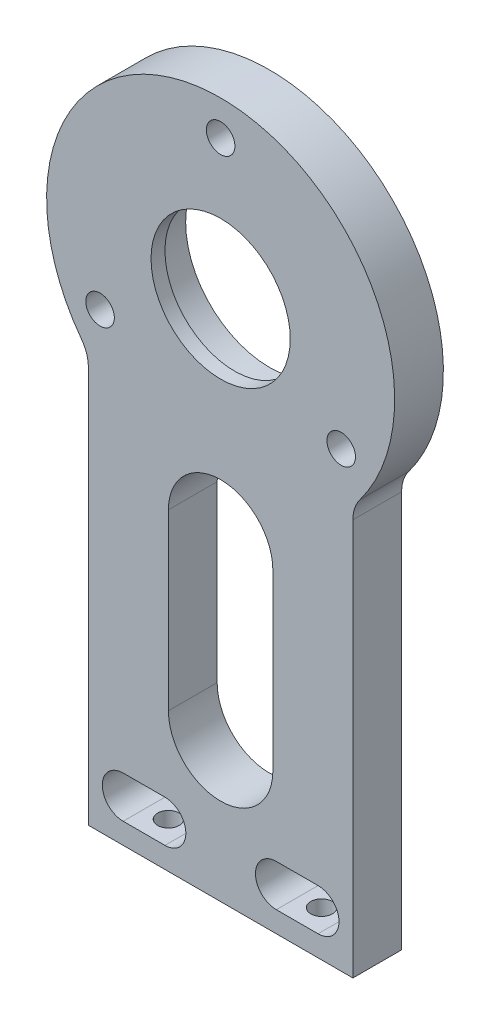
ISO-10303-21;
HEADER;
FILE_DESCRIPTION(('STEP AP214'),'2;1');
FILE_NAME('part.step','',(''),(''),'','','');
FILE_SCHEMA(('AUTOMOTIVE_DESIGN { 1 0 10303 214 1 1 1 1 }'));
ENDSEC;
DATA;
#1=APPLICATION_CONTEXT('core data for automotive mechanical design processes');
#2=APPLICATION_PROTOCOL_DEFINITION('international standard','automotive_design',2000,#1);
#3=PRODUCT_CONTEXT('',#1,'mechanical');
#4=PRODUCT('Part','Part','',(#3));
#5=PRODUCT_RELATED_PRODUCT_CATEGORY('part','',(#4));
#6=PRODUCT_DEFINITION_FORMATION('','',#4);
#7=PRODUCT_DEFINITION_CONTEXT('part definition',#1,'design');
#8=PRODUCT_DEFINITION('design','',#6,#7);
#9=PRODUCT_DEFINITION_SHAPE('','',#8);
#10=(LENGTH_UNIT() NAMED_UNIT(*) SI_UNIT(.MILLI.,.METRE.));
#11=(NAMED_UNIT(*) PLANE_ANGLE_UNIT() SI_UNIT($,.RADIAN.));
#12=(NAMED_UNIT(*) SI_UNIT($,.STERADIAN.) SOLID_ANGLE_UNIT());
#13=UNCERTAINTY_MEASURE_WITH_UNIT(LENGTH_MEASURE(1.E-05),#10,'distance_accuracy_value','');
#14=(GEOMETRIC_REPRESENTATION_CONTEXT(3) GLOBAL_UNCERTAINTY_ASSIGNED_CONTEXT((#13)) GLOBAL_UNIT_ASSIGNED_CONTEXT((#10,
#11,#12)) REPRESENTATION_CONTEXT('',''));
#15=CARTESIAN_POINT('',(0.,0.,0.));
#16=DIRECTION('',(0.,0.,1.));
#17=DIRECTION('',(1.,0.,0.));
#18=AXIS2_PLACEMENT_3D('',#15,#16,#17);
#19=CARTESIAN_POINT('',(0.,95.,3.5));
#20=DIRECTION('',(0.,0.,-1.));
#21=DIRECTION('',(-1.,0.,0.));
#22=AXIS2_PLACEMENT_3D('',#19,#20,#21);
#23=CYLINDRICAL_SURFACE('',#22,2.04999999999999);
#24=CARTESIAN_POINT('',(0.,95.,3.5));
#25=DIRECTION('',(0.,0.,1.));
#26=DIRECTION('',(1.,0.,0.));
#27=AXIS2_PLACEMENT_3D('',#24,#25,#26);
#28=CIRCLE('',#27,2.04999999999999);
#29=CARTESIAN_POINT('',(2.04999999999999,95.,3.5));
#30=VERTEX_POINT('',#29);
#31=EDGE_CURVE('E361',#30,#30,#28,.T.);
#32=ORIENTED_EDGE('',*,*,#31,.T.);
#33=EDGE_LOOP('',(#32));
#34=FACE_BOUND('',#33,.T.);
#35=CARTESIAN_POINT('',(0.,95.,0.5));
#36=DIRECTION('',(0.,0.,-1.));
#37=DIRECTION('',(-1.,0.,0.));
#38=AXIS2_PLACEMENT_3D('',#35,#36,#37);
#39=CIRCLE('',#38,2.04999999999999);
#40=CARTESIAN_POINT('',(-2.04999999999999,95.,0.5));
#41=VERTEX_POINT('',#40);
#42=EDGE_CURVE('E294',#41,#41,#39,.T.);
#43=ORIENTED_EDGE('',*,*,#42,.T.);
#44=EDGE_LOOP('',(#43));
#45=FACE_BOUND('',#44,.T.);
#46=ADVANCED_FACE('F68',(#34,#45),#23,.F.);
#47=CARTESIAN_POINT('',(17.3205080756888,65.,3.5));
#48=DIRECTION('',(0.,0.,-1.));
#49=DIRECTION('',(-1.,0.,0.));
#50=AXIS2_PLACEMENT_3D('',#47,#48,#49);
#51=CYLINDRICAL_SURFACE('',#50,2.04999999999999);
#52=CARTESIAN_POINT('',(17.3205080756888,65.,3.5));
#53=DIRECTION('',(0.,0.,1.));
#54=DIRECTION('',(1.,0.,0.));
#55=AXIS2_PLACEMENT_3D('',#52,#53,#54);
#56=CIRCLE('',#55,2.04999999999999);
#57=CARTESIAN_POINT('',(19.3705080756888,65.,3.5));
#58=VERTEX_POINT('',#57);
#59=EDGE_CURVE('E358',#58,#58,#56,.T.);
#60=ORIENTED_EDGE('',*,*,#59,.T.);
#61=EDGE_LOOP('',(#60));
#62=FACE_BOUND('',#61,.T.);
#63=CARTESIAN_POINT('',(17.3205080756888,65.,0.5));
#64=DIRECTION('',(0.,0.,-1.));
#65=DIRECTION('',(-1.,0.,0.));
#66=AXIS2_PLACEMENT_3D('',#63,#64,#65);
#67=CIRCLE('',#66,2.04999999999999);
#68=CARTESIAN_POINT('',(15.2705080756888,65.,0.5));
#69=VERTEX_POINT('',#68);
#70=EDGE_CURVE('E291',#69,#69,#67,.T.);
#71=ORIENTED_EDGE('',*,*,#70,.T.);
#72=EDGE_LOOP('',(#71));
#73=FACE_BOUND('',#72,.T.);
#74=ADVANCED_FACE('F461',(#62,#73),#51,.F.);
#75=CARTESIAN_POINT('',(-17.3205080756888,65.,3.5));
#76=DIRECTION('',(0.,0.,-1.));
#77=DIRECTION('',(-1.,0.,0.));
#78=AXIS2_PLACEMENT_3D('',#75,#76,#77);
#79=CYLINDRICAL_SURFACE('',#78,2.04999999999998);
#80=CARTESIAN_POINT('',(-17.3205080756888,65.,3.5));
#81=DIRECTION('',(0.,0.,1.));
#82=DIRECTION('',(1.,0.,0.));
#83=AXIS2_PLACEMENT_3D('',#80,#81,#82);
#84=CIRCLE('',#83,2.04999999999998);
#85=CARTESIAN_POINT('',(-15.2705080756888,65.,3.5));
#86=VERTEX_POINT('',#85);
#87=EDGE_CURVE('E355',#86,#86,#84,.T.);
#88=ORIENTED_EDGE('',*,*,#87,.T.);
#89=EDGE_LOOP('',(#88));
#90=FACE_BOUND('',#89,.T.);
#91=CARTESIAN_POINT('',(-17.3205080756888,65.,0.5));
#92=DIRECTION('',(0.,0.,-1.));
#93=DIRECTION('',(-1.,0.,0.));
#94=AXIS2_PLACEMENT_3D('',#91,#92,#93);
#95=CIRCLE('',#94,2.04999999999998);
#96=CARTESIAN_POINT('',(-19.3705080756887,65.,0.5));
#97=VERTEX_POINT('',#96);
#98=EDGE_CURVE('E288',#97,#97,#95,.T.);
#99=ORIENTED_EDGE('',*,*,#98,.T.);
#100=EDGE_LOOP('',(#99));
#101=FACE_BOUND('',#100,.T.);
#102=ADVANCED_FACE('F467',(#90,#101),#79,.F.);
#103=CARTESIAN_POINT('',(0.,75.,3.5));
#104=DIRECTION('',(0.,0.,-1.));
#105=DIRECTION('',(-1.,0.,0.));
#106=AXIS2_PLACEMENT_3D('',#103,#104,#105);
#107=CYLINDRICAL_SURFACE('',#106,10.);
#108=CARTESIAN_POINT('',(0.,75.,3.5));
#109=DIRECTION('',(0.,0.,1.));
#110=DIRECTION('',(1.,0.,0.));
#111=AXIS2_PLACEMENT_3D('',#108,#109,#110);
#112=CIRCLE('',#111,10.);
#113=CARTESIAN_POINT('',(10.,75.,3.5));
#114=VERTEX_POINT('',#113);
#115=EDGE_CURVE('E364',#114,#114,#112,.T.);
#116=ORIENTED_EDGE('',*,*,#115,.T.);
#117=EDGE_LOOP('',(#116));
#118=FACE_BOUND('',#117,.T.);
#119=CARTESIAN_POINT('',(0.,75.,1.5));
#120=DIRECTION('',(0.,0.,-1.));
#121=DIRECTION('',(-1.,0.,0.));
#122=AXIS2_PLACEMENT_3D('',#119,#120,#121);
#123=CIRCLE('',#122,10.);
#124=CARTESIAN_POINT('',(-10.,75.,1.5));
#125=VERTEX_POINT('',#124);
#126=EDGE_CURVE('E284',#125,#125,#123,.T.);
#127=ORIENTED_EDGE('',*,*,#126,.T.);
#128=EDGE_LOOP('',(#127));
#129=FACE_BOUND('',#128,.T.);
#130=ADVANCED_FACE('F471',(#118,#129),#107,.F.);
#131=CARTESIAN_POINT('',(0.,0.,3.5));
#132=DIRECTION('',(0.,0.,1.));
#133=DIRECTION('',(1.,0.,0.));
#134=AXIS2_PLACEMENT_3D('',#131,#132,#133);
#135=PLANE('',#134);
#136=CARTESIAN_POINT('',(24.,57.,3.5));
#137=DIRECTION('',(0.,0.,1.));
#138=DIRECTION('',(1.,0.,0.));
#139=AXIS2_PLACEMENT_3D('',#136,#137,#138);
#140=CIRCLE('',#139,4.99999999999999);
#141=CARTESIAN_POINT('',(19.,57.,3.5));
#142=VERTEX_POINT('',#141);
#143=CARTESIAN_POINT('',(20.,60.,3.5));
#144=VERTEX_POINT('',#143);
#145=EDGE_CURVE('E342',#142,#144,#140,.F.);
#146=ORIENTED_EDGE('',*,*,#145,.T.);
#147=CARTESIAN_POINT('',(0.,75.,3.5));
#148=DIRECTION('',(0.,0.,1.));
#149=DIRECTION('',(1.,0.,0.));
#150=AXIS2_PLACEMENT_3D('',#147,#148,#149);
#151=CIRCLE('',#150,25.);
#152=CARTESIAN_POINT('',(-20.,60.,3.5));
#153=VERTEX_POINT('',#152);
#154=EDGE_CURVE('E154',#144,#153,#151,.T.);
#155=ORIENTED_EDGE('',*,*,#154,.T.);
#156=CARTESIAN_POINT('',(-24.,57.,3.5));
#157=DIRECTION('',(0.,0.,1.));
#158=DIRECTION('',(1.,0.,0.));
#159=AXIS2_PLACEMENT_3D('',#156,#157,#158);
#160=CIRCLE('',#159,4.99999999999999);
#161=CARTESIAN_POINT('',(-19.,57.,3.5));
#162=VERTEX_POINT('',#161);
#163=EDGE_CURVE('E345',#162,#153,#160,.T.);
#164=ORIENTED_EDGE('',*,*,#163,.F.);
#165=DIRECTION('',(0.,-1.,0.));
#166=VECTOR('',#165,1.);
#167=CARTESIAN_POINT('',(-19.,0.,3.5));
#168=LINE('',#167,#166);
#169=CARTESIAN_POINT('',(-19.,0.,3.5));
#170=VERTEX_POINT('',#169);
#171=EDGE_CURVE('E348',#162,#170,#168,.T.);
#172=ORIENTED_EDGE('',*,*,#171,.T.);
#173=DIRECTION('',(1.,0.,0.));
#174=VECTOR('',#173,1.);
#175=CARTESIAN_POINT('',(0.,0.,3.5));
#176=LINE('',#175,#174);
#177=CARTESIAN_POINT('',(19.,0.,3.5));
#178=VERTEX_POINT('',#177);
#179=EDGE_CURVE('E350',#170,#178,#176,.T.);
#180=ORIENTED_EDGE('',*,*,#179,.T.);
#181=DIRECTION('',(0.,-1.,0.));
#182=VECTOR('',#181,1.);
#183=CARTESIAN_POINT('',(19.,0.,3.5));
#184=LINE('',#183,#182);
#185=EDGE_CURVE('E352',#142,#178,#184,.T.);
#186=ORIENTED_EDGE('',*,*,#185,.F.);
#187=EDGE_LOOP('',(#146,#155,#164,#172,#180,#186));
#188=FACE_BOUND('',#187,.T.);
#189=ORIENTED_EDGE('',*,*,#87,.F.);
#190=EDGE_LOOP('',(#189));
#191=FACE_BOUND('',#190,.T.);
#192=ORIENTED_EDGE('',*,*,#59,.F.);
#193=EDGE_LOOP('',(#192));
#194=FACE_BOUND('',#193,.T.);
#195=ORIENTED_EDGE('',*,*,#31,.F.);
#196=EDGE_LOOP('',(#195));
#197=FACE_BOUND('',#196,.T.);
#198=ORIENTED_EDGE('',*,*,#115,.F.);
#199=EDGE_LOOP('',(#198));
#200=FACE_BOUND('',#199,.T.);
#201=CARTESIAN_POINT('',(-14.,6.,3.5));
#202=DIRECTION('',(0.,0.,1.));
#203=DIRECTION('',(1.,0.,0.));
#204=AXIS2_PLACEMENT_3D('',#201,#202,#203);
#205=CIRCLE('',#204,3.);
#206=CARTESIAN_POINT('',(-14.,9.,3.5));
#207=VERTEX_POINT('',#206);
#208=CARTESIAN_POINT('',(-14.,3.,3.5));
#209=VERTEX_POINT('',#208);
#210=EDGE_CURVE('E367',#207,#209,#205,.T.);
#211=ORIENTED_EDGE('',*,*,#210,.F.);
#212=DIRECTION('',(-1.,0.,0.));
#213=VECTOR('',#212,1.);
#214=CARTESIAN_POINT('',(0.,9.00000000000001,3.5));
#215=LINE('',#214,#213);
#216=CARTESIAN_POINT('',(-8.,9.00000000000001,3.5));
#217=VERTEX_POINT('',#216);
#218=EDGE_CURVE('E370',#217,#207,#215,.T.);
#219=ORIENTED_EDGE('',*,*,#218,.F.);
#220=CARTESIAN_POINT('',(-8.,6.,3.5));
#221=DIRECTION('',(0.,0.,1.));
#222=DIRECTION('',(1.,0.,0.));
#223=AXIS2_PLACEMENT_3D('',#220,#221,#222);
#224=CIRCLE('',#223,3.);
#225=CARTESIAN_POINT('',(-8.,3.,3.5));
#226=VERTEX_POINT('',#225);
#227=EDGE_CURVE('E373',#226,#217,#224,.T.);
#228=ORIENTED_EDGE('',*,*,#227,.F.);
#229=DIRECTION('',(-1.,0.,0.));
#230=VECTOR('',#229,1.);
#231=CARTESIAN_POINT('',(0.,3.,3.5));
#232=LINE('',#231,#230);
#233=EDGE_CURVE('E376',#226,#209,#232,.T.);
#234=ORIENTED_EDGE('',*,*,#233,.T.);
#235=EDGE_LOOP('',(#211,#219,#228,#234));
#236=FACE_BOUND('',#235,.T.);
#237=DIRECTION('',(1.,0.,0.));
#238=VECTOR('',#237,1.);
#239=CARTESIAN_POINT('',(0.,9.00000000000001,3.5));
#240=LINE('',#239,#238);
#241=CARTESIAN_POINT('',(8.,9.00000000000001,3.5));
#242=VERTEX_POINT('',#241);
#243=CARTESIAN_POINT('',(14.,9.,3.5));
#244=VERTEX_POINT('',#243);
#245=EDGE_CURVE('E194',#242,#244,#240,.T.);
#246=ORIENTED_EDGE('',*,*,#245,.T.);
#247=CARTESIAN_POINT('',(14.,6.,3.5));
#248=DIRECTION('',(0.,0.,1.));
#249=DIRECTION('',(1.,0.,0.));
#250=AXIS2_PLACEMENT_3D('',#247,#248,#249);
#251=CIRCLE('',#250,3.);
#252=CARTESIAN_POINT('',(14.,3.,3.5));
#253=VERTEX_POINT('',#252);
#254=EDGE_CURVE('E187',#244,#253,#251,.F.);
#255=ORIENTED_EDGE('',*,*,#254,.T.);
#256=DIRECTION('',(1.,0.,0.));
#257=VECTOR('',#256,1.);
#258=CARTESIAN_POINT('',(0.,3.,3.5));
#259=LINE('',#258,#257);
#260=CARTESIAN_POINT('',(8.,3.,3.5));
#261=VERTEX_POINT('',#260);
#262=EDGE_CURVE('E192',#261,#253,#259,.T.);
#263=ORIENTED_EDGE('',*,*,#262,.F.);
#264=CARTESIAN_POINT('',(8.,6.,3.5));
#265=DIRECTION('',(0.,0.,1.));
#266=DIRECTION('',(1.,0.,0.));
#267=AXIS2_PLACEMENT_3D('',#264,#265,#266);
#268=CIRCLE('',#267,3.);
#269=EDGE_CURVE('E94',#261,#242,#268,.F.);
#270=ORIENTED_EDGE('',*,*,#269,.T.);
#271=EDGE_LOOP('',(#246,#255,#263,#270));
#272=FACE_BOUND('',#271,.T.);
#273=DIRECTION('',(0.,-1.,0.));
#274=VECTOR('',#273,1.);
#275=CARTESIAN_POINT('',(-7.5,45.,3.5));
#276=LINE('',#275,#274);
#277=CARTESIAN_POINT('',(-7.5,45.,3.5));
#278=VERTEX_POINT('',#277);
#279=CARTESIAN_POINT('',(-7.5,20.,3.5));
#280=VERTEX_POINT('',#279);
#281=EDGE_CURVE('E310',#278,#280,#276,.T.);
#282=ORIENTED_EDGE('',*,*,#281,.F.);
#283=CARTESIAN_POINT('',(0.,45.,3.5));
#284=DIRECTION('',(0.,0.,1.));
#285=DIRECTION('',(1.,0.,0.));
#286=AXIS2_PLACEMENT_3D('',#283,#284,#285);
#287=CIRCLE('',#286,7.5);
#288=CARTESIAN_POINT('',(-5.07645538792133,50.5208333333333,3.5));
#289=VERTEX_POINT('',#288);
#290=EDGE_CURVE('E311',#289,#278,#287,.T.);
#291=ORIENTED_EDGE('',*,*,#290,.F.);
#292=CARTESIAN_POINT('',(0.,45.,3.5));
#293=DIRECTION('',(0.,0.,1.));
#294=DIRECTION('',(1.,0.,0.));
#295=AXIS2_PLACEMENT_3D('',#292,#293,#294);
#296=CIRCLE('',#295,7.5);
#297=CARTESIAN_POINT('',(5.07645538792134,50.5208333333333,3.5));
#298=VERTEX_POINT('',#297);
#299=EDGE_CURVE('E254',#298,#289,#296,.T.);
#300=ORIENTED_EDGE('',*,*,#299,.F.);
#301=CARTESIAN_POINT('',(7.5,45.,3.5));
#302=VERTEX_POINT('',#301);
#303=EDGE_CURVE('E307',#302,#298,#287,.T.);
#304=ORIENTED_EDGE('',*,*,#303,.F.);
#305=DIRECTION('',(0.,-1.,0.));
#306=VECTOR('',#305,1.);
#307=CARTESIAN_POINT('',(7.5,45.,3.5));
#308=LINE('',#307,#306);
#309=CARTESIAN_POINT('',(7.5,20.,3.5));
#310=VERTEX_POINT('',#309);
#311=EDGE_CURVE('E317',#302,#310,#308,.T.);
#312=ORIENTED_EDGE('',*,*,#311,.T.);
#313=CARTESIAN_POINT('',(0.,20.,3.5));
#314=DIRECTION('',(0.,0.,1.));
#315=DIRECTION('',(1.,0.,0.));
#316=AXIS2_PLACEMENT_3D('',#313,#314,#315);
#317=CIRCLE('',#316,7.5);
#318=EDGE_CURVE('E314',#280,#310,#317,.T.);
#319=ORIENTED_EDGE('',*,*,#318,.F.);
#320=EDGE_LOOP('',(#282,#291,#300,#304,#312,#319));
#321=FACE_BOUND('',#320,.T.);
#322=ADVANCED_FACE('F189',(#188,#191,#194,#197,#200,#236,#272,#321),#135,.T.);
#323=CARTESIAN_POINT('',(0.,0.,-3.5));
#324=DIRECTION('',(0.,0.,1.));
#325=DIRECTION('',(1.,0.,0.));
#326=AXIS2_PLACEMENT_3D('',#323,#324,#325);
#327=PLANE('',#326);
#328=CARTESIAN_POINT('',(0.,95.,-3.5));
#329=DIRECTION('',(0.,0.,-1.));
#330=DIRECTION('',(-1.,0.,0.));
#331=AXIS2_PLACEMENT_3D('',#328,#329,#330);
#332=CIRCLE('',#331,3.60000000000001);
#333=CARTESIAN_POINT('',(-3.60000000000001,95.,-3.5));
#334=VERTEX_POINT('',#333);
#335=EDGE_CURVE('E726',#334,#334,#332,.T.);
#336=ORIENTED_EDGE('',*,*,#335,.F.);
#337=EDGE_LOOP('',(#336));
#338=FACE_BOUND('',#337,.T.);
#339=CARTESIAN_POINT('',(-17.3205080756888,65.,-3.5));
#340=DIRECTION('',(0.,0.,-1.));
#341=DIRECTION('',(-1.,0.,0.));
#342=AXIS2_PLACEMENT_3D('',#339,#340,#341);
#343=CIRCLE('',#342,3.6);
#344=CARTESIAN_POINT('',(-20.9205080756888,65.,-3.5));
#345=VERTEX_POINT('',#344);
#346=EDGE_CURVE('E732',#345,#345,#343,.T.);
#347=ORIENTED_EDGE('',*,*,#346,.F.);
#348=EDGE_LOOP('',(#347));
#349=FACE_BOUND('',#348,.T.);
#350=CARTESIAN_POINT('',(17.3205080756888,65.,-3.5));
#351=DIRECTION('',(0.,0.,-1.));
#352=DIRECTION('',(-1.,0.,0.));
#353=AXIS2_PLACEMENT_3D('',#350,#351,#352);
#354=CIRCLE('',#353,3.6);
#355=CARTESIAN_POINT('',(13.7205080756888,65.,-3.5));
#356=VERTEX_POINT('',#355);
#357=EDGE_CURVE('E723',#356,#356,#354,.T.);
#358=ORIENTED_EDGE('',*,*,#357,.F.);
#359=EDGE_LOOP('',(#358));
#360=FACE_BOUND('',#359,.T.);
#361=CARTESIAN_POINT('',(0.,75.,-3.5));
#362=DIRECTION('',(0.,0.,-1.));
#363=DIRECTION('',(-1.,0.,0.));
#364=AXIS2_PLACEMENT_3D('',#361,#362,#363);
#365=CIRCLE('',#364,12.025);
#366=CARTESIAN_POINT('',(-12.025,75.,-3.5));
#367=VERTEX_POINT('',#366);
#368=EDGE_CURVE('E296',#367,#367,#365,.T.);
#369=ORIENTED_EDGE('',*,*,#368,.F.);
#370=EDGE_LOOP('',(#369));
#371=FACE_BOUND('',#370,.T.);
#372=DIRECTION('',(1.,0.,0.));
#373=VECTOR('',#372,1.);
#374=CARTESIAN_POINT('',(0.,9.00000000000001,-3.5));
#375=LINE('',#374,#373);
#376=CARTESIAN_POINT('',(8.,9.00000000000001,-3.5));
#377=VERTEX_POINT('',#376);
#378=CARTESIAN_POINT('',(14.,9.,-3.5));
#379=VERTEX_POINT('',#378);
#380=EDGE_CURVE('E247',#377,#379,#375,.T.);
#381=ORIENTED_EDGE('',*,*,#380,.F.);
#382=CARTESIAN_POINT('',(8.,6.,-3.5));
#383=DIRECTION('',(0.,0.,1.));
#384=DIRECTION('',(1.,0.,0.));
#385=AXIS2_PLACEMENT_3D('',#382,#383,#384);
#386=CIRCLE('',#385,3.);
#387=CARTESIAN_POINT('',(8.,3.,-3.5));
#388=VERTEX_POINT('',#387);
#389=EDGE_CURVE('E145',#388,#377,#386,.F.);
#390=ORIENTED_EDGE('',*,*,#389,.F.);
#391=DIRECTION('',(1.,0.,0.));
#392=VECTOR('',#391,1.);
#393=CARTESIAN_POINT('',(0.,3.,-3.5));
#394=LINE('',#393,#392);
#395=CARTESIAN_POINT('',(14.,3.,-3.5));
#396=VERTEX_POINT('',#395);
#397=EDGE_CURVE('E251',#388,#396,#394,.T.);
#398=ORIENTED_EDGE('',*,*,#397,.T.);
#399=CARTESIAN_POINT('',(14.,6.,-3.5));
#400=DIRECTION('',(0.,0.,1.));
#401=DIRECTION('',(1.,0.,0.));
#402=AXIS2_PLACEMENT_3D('',#399,#400,#401);
#403=CIRCLE('',#402,3.);
#404=EDGE_CURVE('E202',#379,#396,#403,.F.);
#405=ORIENTED_EDGE('',*,*,#404,.F.);
#406=EDGE_LOOP('',(#381,#390,#398,#405));
#407=FACE_BOUND('',#406,.T.);
#408=CARTESIAN_POINT('',(-14.,6.,-3.5));
#409=DIRECTION('',(0.,0.,1.));
#410=DIRECTION('',(1.,0.,0.));
#411=AXIS2_PLACEMENT_3D('',#408,#409,#410);
#412=CIRCLE('',#411,3.);
#413=CARTESIAN_POINT('',(-14.,9.,-3.5));
#414=VERTEX_POINT('',#413);
#415=CARTESIAN_POINT('',(-14.,3.,-3.5));
#416=VERTEX_POINT('',#415);
#417=EDGE_CURVE('E235',#414,#416,#412,.T.);
#418=ORIENTED_EDGE('',*,*,#417,.T.);
#419=DIRECTION('',(-1.,0.,0.));
#420=VECTOR('',#419,1.);
#421=CARTESIAN_POINT('',(0.,3.,-3.5));
#422=LINE('',#421,#420);
#423=CARTESIAN_POINT('',(-8.,3.,-3.5));
#424=VERTEX_POINT('',#423);
#425=EDGE_CURVE('E244',#424,#416,#422,.T.);
#426=ORIENTED_EDGE('',*,*,#425,.F.);
#427=CARTESIAN_POINT('',(-8.,6.,-3.5));
#428=DIRECTION('',(0.,0.,1.));
#429=DIRECTION('',(1.,0.,0.));
#430=AXIS2_PLACEMENT_3D('',#427,#428,#429);
#431=CIRCLE('',#430,3.);
#432=CARTESIAN_POINT('',(-8.,9.00000000000001,-3.5));
#433=VERTEX_POINT('',#432);
#434=EDGE_CURVE('E241',#424,#433,#431,.T.);
#435=ORIENTED_EDGE('',*,*,#434,.T.);
#436=DIRECTION('',(-1.,0.,0.));
#437=VECTOR('',#436,1.);
#438=CARTESIAN_POINT('',(0.,9.00000000000001,-3.5));
#439=LINE('',#438,#437);
#440=EDGE_CURVE('E238',#433,#414,#439,.T.);
#441=ORIENTED_EDGE('',*,*,#440,.T.);
#442=EDGE_LOOP('',(#418,#426,#435,#441));
#443=FACE_BOUND('',#442,.T.);
#444=CARTESIAN_POINT('',(24.,57.,-3.5));
#445=DIRECTION('',(0.,0.,1.));
#446=DIRECTION('',(1.,0.,0.));
#447=AXIS2_PLACEMENT_3D('',#444,#445,#446);
#448=CIRCLE('',#447,4.99999999999999);
#449=CARTESIAN_POINT('',(19.,57.,-3.5));
#450=VERTEX_POINT('',#449);
#451=CARTESIAN_POINT('',(20.,60.,-3.5));
#452=VERTEX_POINT('',#451);
#453=EDGE_CURVE('E217',#450,#452,#448,.F.);
#454=ORIENTED_EDGE('',*,*,#453,.F.);
#455=DIRECTION('',(0.,-1.,0.));
#456=VECTOR('',#455,1.);
#457=CARTESIAN_POINT('',(19.,0.,-3.5));
#458=LINE('',#457,#456);
#459=CARTESIAN_POINT('',(19.,0.,-3.5));
#460=VERTEX_POINT('',#459);
#461=EDGE_CURVE('E232',#450,#460,#458,.T.);
#462=ORIENTED_EDGE('',*,*,#461,.T.);
#463=DIRECTION('',(1.,0.,0.));
#464=VECTOR('',#463,1.);
#465=CARTESIAN_POINT('',(0.,0.,-3.5));
#466=LINE('',#465,#464);
#467=CARTESIAN_POINT('',(-19.,0.,-3.5));
#468=VERTEX_POINT('',#467);
#469=EDGE_CURVE('E229',#468,#460,#466,.T.);
#470=ORIENTED_EDGE('',*,*,#469,.F.);
#471=DIRECTION('',(0.,-1.,0.));
#472=VECTOR('',#471,1.);
#473=CARTESIAN_POINT('',(-19.,0.,-3.5));
#474=LINE('',#473,#472);
#475=CARTESIAN_POINT('',(-19.,57.,-3.5));
#476=VERTEX_POINT('',#475);
#477=EDGE_CURVE('E227',#476,#468,#474,.T.);
#478=ORIENTED_EDGE('',*,*,#477,.F.);
#479=CARTESIAN_POINT('',(-24.,57.,-3.5));
#480=DIRECTION('',(0.,0.,1.));
#481=DIRECTION('',(1.,0.,0.));
#482=AXIS2_PLACEMENT_3D('',#479,#480,#481);
#483=CIRCLE('',#482,4.99999999999999);
#484=CARTESIAN_POINT('',(-20.,60.,-3.5));
#485=VERTEX_POINT('',#484);
#486=EDGE_CURVE('E224',#476,#485,#483,.T.);
#487=ORIENTED_EDGE('',*,*,#486,.T.);
#488=CARTESIAN_POINT('',(0.,75.,-3.5));
#489=DIRECTION('',(0.,0.,1.));
#490=DIRECTION('',(1.,0.,0.));
#491=AXIS2_PLACEMENT_3D('',#488,#489,#490);
#492=CIRCLE('',#491,25.);
#493=EDGE_CURVE('E221',#452,#485,#492,.T.);
#494=ORIENTED_EDGE('',*,*,#493,.F.);
#495=EDGE_LOOP('',(#454,#462,#470,#478,#487,#494));
#496=FACE_BOUND('',#495,.T.);
#497=CARTESIAN_POINT('',(0.,45.,-3.5));
#498=DIRECTION('',(0.,0.,1.));
#499=DIRECTION('',(1.,0.,0.));
#500=AXIS2_PLACEMENT_3D('',#497,#498,#499);
#501=CIRCLE('',#500,7.5);
#502=CARTESIAN_POINT('',(-7.5,45.,-3.5));
#503=VERTEX_POINT('',#502);
#504=CARTESIAN_POINT('',(-5.07645538792133,50.5208333333333,-3.5));
#505=VERTEX_POINT('',#504);
#506=EDGE_CURVE('E12',#503,#505,#501,.F.);
#507=ORIENTED_EDGE('',*,*,#506,.F.);
#508=DIRECTION('',(0.,-1.,0.));
#509=VECTOR('',#508,1.);
#510=CARTESIAN_POINT('',(-7.5,45.,-3.5));
#511=LINE('',#510,#509);
#512=CARTESIAN_POINT('',(-7.5,20.,-3.5));
#513=VERTEX_POINT('',#512);
#514=EDGE_CURVE('E322',#503,#513,#511,.T.);
#515=ORIENTED_EDGE('',*,*,#514,.T.);
#516=CARTESIAN_POINT('',(0.,20.,-3.5));
#517=DIRECTION('',(0.,0.,1.));
#518=DIRECTION('',(1.,0.,0.));
#519=AXIS2_PLACEMENT_3D('',#516,#517,#518);
#520=CIRCLE('',#519,7.5);
#521=CARTESIAN_POINT('',(7.5,20.,-3.5));
#522=VERTEX_POINT('',#521);
#523=EDGE_CURVE('E325',#513,#522,#520,.T.);
#524=ORIENTED_EDGE('',*,*,#523,.T.);
#525=DIRECTION('',(0.,-1.,0.));
#526=VECTOR('',#525,1.);
#527=CARTESIAN_POINT('',(7.5,45.,-3.5));
#528=LINE('',#527,#526);
#529=CARTESIAN_POINT('',(7.5,45.,-3.5));
#530=VERTEX_POINT('',#529);
#531=EDGE_CURVE('E328',#530,#522,#528,.T.);
#532=ORIENTED_EDGE('',*,*,#531,.F.);
#533=CARTESIAN_POINT('',(0.,45.,-3.5));
#534=DIRECTION('',(0.,0.,1.));
#535=DIRECTION('',(1.,0.,0.));
#536=AXIS2_PLACEMENT_3D('',#533,#534,#535);
#537=CIRCLE('',#536,7.5);
#538=CARTESIAN_POINT('',(5.07645538792133,50.5208333333333,-3.5));
#539=VERTEX_POINT('',#538);
#540=EDGE_CURVE('E85',#530,#539,#537,.T.);
#541=ORIENTED_EDGE('',*,*,#540,.T.);
#542=CARTESIAN_POINT('',(0.,45.,-3.5));
#543=DIRECTION('',(0.,0.,1.));
#544=DIRECTION('',(1.,0.,0.));
#545=AXIS2_PLACEMENT_3D('',#542,#543,#544);
#546=CIRCLE('',#545,7.5);
#547=EDGE_CURVE('E214',#539,#505,#546,.T.);
#548=ORIENTED_EDGE('',*,*,#547,.T.);
#549=EDGE_LOOP('',(#507,#515,#524,#532,#541,#548));
#550=FACE_BOUND('',#549,.T.);
#551=ADVANCED_FACE('F396',(#338,#349,#360,#371,#407,#443,#496,#550),#327,.F.);
#552=CARTESIAN_POINT('',(0.,9.00000000000001,3.5));
#553=DIRECTION('',(0.,1.,0.));
#554=DIRECTION('',(-1.,0.,0.));
#555=AXIS2_PLACEMENT_3D('',#552,#553,#554);
#556=PLANE('',#555);
#557=ORIENTED_EDGE('',*,*,#380,.T.);
#558=DIRECTION('',(0.,0.,-1.));
#559=VECTOR('',#558,1.);
#560=CARTESIAN_POINT('',(14.,9.,3.5));
#561=LINE('',#560,#559);
#562=EDGE_CURVE('E77',#244,#379,#561,.T.);
#563=ORIENTED_EDGE('',*,*,#562,.F.);
#564=ORIENTED_EDGE('',*,*,#245,.F.);
#565=DIRECTION('',(0.,0.,-1.));
#566=VECTOR('',#565,1.);
#567=CARTESIAN_POINT('',(8.,9.00000000000001,3.5));
#568=LINE('',#567,#566);
#569=EDGE_CURVE('E255',#242,#377,#568,.T.);
#570=ORIENTED_EDGE('',*,*,#569,.T.);
#571=EDGE_LOOP('',(#557,#563,#564,#570));
#572=FACE_BOUND('',#571,.T.);
#573=ADVANCED_FACE('F399',(#572),#556,.F.);
#574=CARTESIAN_POINT('',(14.,6.,3.5));
#575=DIRECTION('',(0.,0.,-1.));
#576=DIRECTION('',(-1.,0.,0.));
#577=AXIS2_PLACEMENT_3D('',#574,#575,#576);
#578=CYLINDRICAL_SURFACE('',#577,3.);
#579=ORIENTED_EDGE('',*,*,#404,.T.);
#580=DIRECTION('',(0.,0.,-1.));
#581=VECTOR('',#580,1.);
#582=CARTESIAN_POINT('',(14.,3.,3.5));
#583=LINE('',#582,#581);
#584=EDGE_CURVE('E200',#253,#396,#583,.T.);
#585=ORIENTED_EDGE('',*,*,#584,.F.);
#586=ORIENTED_EDGE('',*,*,#254,.F.);
#587=ORIENTED_EDGE('',*,*,#562,.T.);
#588=EDGE_LOOP('',(#579,#585,#586,#587));
#589=FACE_BOUND('',#588,.T.);
#590=ADVANCED_FACE('F201',(#589),#578,.F.);
#591=CARTESIAN_POINT('',(0.,3.,3.5));
#592=DIRECTION('',(0.,1.,0.));
#593=DIRECTION('',(-1.,0.,0.));
#594=AXIS2_PLACEMENT_3D('',#591,#592,#593);
#595=PLANE('',#594);
#596=CARTESIAN_POINT('',(11.,3.,0.));
#597=DIRECTION('',(0.,1.,0.));
#598=DIRECTION('',(-1.,0.,0.));
#599=AXIS2_PLACEMENT_3D('',#596,#597,#598);
#600=CIRCLE('',#599,1.55);
#601=CARTESIAN_POINT('',(9.45,3.,0.));
#602=VERTEX_POINT('',#601);
#603=EDGE_CURVE('E712',#602,#602,#600,.T.);
#604=ORIENTED_EDGE('',*,*,#603,.F.);
#605=EDGE_LOOP('',(#604));
#606=FACE_BOUND('',#605,.T.);
#607=ORIENTED_EDGE('',*,*,#397,.F.);
#608=DIRECTION('',(0.,0.,-1.));
#609=VECTOR('',#608,1.);
#610=CARTESIAN_POINT('',(8.,3.,3.5));
#611=LINE('',#610,#609);
#612=EDGE_CURVE('E206',#261,#388,#611,.T.);
#613=ORIENTED_EDGE('',*,*,#612,.F.);
#614=ORIENTED_EDGE('',*,*,#262,.T.);
#615=ORIENTED_EDGE('',*,*,#584,.T.);
#616=EDGE_LOOP('',(#607,#613,#614,#615));
#617=FACE_BOUND('',#616,.T.);
#618=ADVANCED_FACE('F208',(#606,#617),#595,.T.);
#619=CARTESIAN_POINT('',(-14.,6.,3.5));
#620=DIRECTION('',(0.,0.,-1.));
#621=DIRECTION('',(-1.,0.,0.));
#622=AXIS2_PLACEMENT_3D('',#619,#620,#621);
#623=CYLINDRICAL_SURFACE('',#622,3.);
#624=ORIENTED_EDGE('',*,*,#417,.F.);
#625=DIRECTION('',(0.,0.,-1.));
#626=VECTOR('',#625,1.);
#627=CARTESIAN_POINT('',(-14.,9.,3.5));
#628=LINE('',#627,#626);
#629=EDGE_CURVE('E257',#207,#414,#628,.T.);
#630=ORIENTED_EDGE('',*,*,#629,.F.);
#631=ORIENTED_EDGE('',*,*,#210,.T.);
#632=DIRECTION('',(0.,0.,-1.));
#633=VECTOR('',#632,1.);
#634=CARTESIAN_POINT('',(-14.,3.,3.5));
#635=LINE('',#634,#633);
#636=EDGE_CURVE('E260',#209,#416,#635,.T.);
#637=ORIENTED_EDGE('',*,*,#636,.T.);
#638=EDGE_LOOP('',(#624,#630,#631,#637));
#639=FACE_BOUND('',#638,.T.);
#640=ADVANCED_FACE('F388',(#639),#623,.F.);
#641=CARTESIAN_POINT('',(0.,9.00000000000001,3.5));
#642=DIRECTION('',(0.,-1.,0.));
#643=DIRECTION('',(1.,0.,0.));
#644=AXIS2_PLACEMENT_3D('',#641,#642,#643);
#645=PLANE('',#644);
#646=ORIENTED_EDGE('',*,*,#440,.F.);
#647=DIRECTION('',(0.,0.,-1.));
#648=VECTOR('',#647,1.);
#649=CARTESIAN_POINT('',(-8.,9.00000000000001,3.5));
#650=LINE('',#649,#648);
#651=EDGE_CURVE('E265',#217,#433,#650,.T.);
#652=ORIENTED_EDGE('',*,*,#651,.F.);
#653=ORIENTED_EDGE('',*,*,#218,.T.);
#654=ORIENTED_EDGE('',*,*,#629,.T.);
#655=EDGE_LOOP('',(#646,#652,#653,#654));
#656=FACE_BOUND('',#655,.T.);
#657=ADVANCED_FACE('F391',(#656),#645,.T.);
#658=CARTESIAN_POINT('',(-8.,6.,3.5));
#659=DIRECTION('',(0.,0.,-1.));
#660=DIRECTION('',(-1.,0.,0.));
#661=AXIS2_PLACEMENT_3D('',#658,#659,#660);
#662=CYLINDRICAL_SURFACE('',#661,3.);
#663=ORIENTED_EDGE('',*,*,#434,.F.);
#664=DIRECTION('',(0.,0.,-1.));
#665=VECTOR('',#664,1.);
#666=CARTESIAN_POINT('',(-8.,3.,3.5));
#667=LINE('',#666,#665);
#668=EDGE_CURVE('E262',#226,#424,#667,.T.);
#669=ORIENTED_EDGE('',*,*,#668,.F.);
#670=ORIENTED_EDGE('',*,*,#227,.T.);
#671=ORIENTED_EDGE('',*,*,#651,.T.);
#672=EDGE_LOOP('',(#663,#669,#670,#671));
#673=FACE_BOUND('',#672,.T.);
#674=ADVANCED_FACE('F394',(#673),#662,.F.);
#675=CARTESIAN_POINT('',(24.,57.,3.5));
#676=DIRECTION('',(0.,0.,-1.));
#677=DIRECTION('',(-1.,0.,0.));
#678=AXIS2_PLACEMENT_3D('',#675,#676,#677);
#679=CYLINDRICAL_SURFACE('',#678,4.99999999999999);
#680=ORIENTED_EDGE('',*,*,#453,.T.);
#681=DIRECTION('',(0.,0.,-1.));
#682=VECTOR('',#681,1.);
#683=CARTESIAN_POINT('',(20.,60.,3.5));
#684=LINE('',#683,#682);
#685=EDGE_CURVE('E263',#144,#452,#684,.T.);
#686=ORIENTED_EDGE('',*,*,#685,.F.);
#687=ORIENTED_EDGE('',*,*,#145,.F.);
#688=DIRECTION('',(0.,0.,-1.));
#689=VECTOR('',#688,1.);
#690=CARTESIAN_POINT('',(19.,57.,3.5));
#691=LINE('',#690,#689);
#692=EDGE_CURVE('E268',#142,#450,#691,.T.);
#693=ORIENTED_EDGE('',*,*,#692,.T.);
#694=EDGE_LOOP('',(#680,#686,#687,#693));
#695=FACE_BOUND('',#694,.T.);
#696=ADVANCED_FACE('F495',(#695),#679,.F.);
#697=CARTESIAN_POINT('',(0.,75.,3.5));
#698=DIRECTION('',(0.,0.,-1.));
#699=DIRECTION('',(-1.,0.,0.));
#700=AXIS2_PLACEMENT_3D('',#697,#698,#699);
#701=CYLINDRICAL_SURFACE('',#700,25.);
#702=ORIENTED_EDGE('',*,*,#493,.T.);
#703=DIRECTION('',(0.,0.,-1.));
#704=VECTOR('',#703,1.);
#705=CARTESIAN_POINT('',(-20.,60.,3.5));
#706=LINE('',#705,#704);
#707=EDGE_CURVE('E278',#153,#485,#706,.T.);
#708=ORIENTED_EDGE('',*,*,#707,.F.);
#709=ORIENTED_EDGE('',*,*,#154,.F.);
#710=ORIENTED_EDGE('',*,*,#685,.T.);
#711=EDGE_LOOP('',(#702,#708,#709,#710));
#712=FACE_BOUND('',#711,.T.);
#713=ADVANCED_FACE('F492',(#712),#701,.T.);
#714=CARTESIAN_POINT('',(-24.,57.,3.5));
#715=DIRECTION('',(0.,0.,-1.));
#716=DIRECTION('',(-1.,0.,0.));
#717=AXIS2_PLACEMENT_3D('',#714,#715,#716);
#718=CYLINDRICAL_SURFACE('',#717,4.99999999999999);
#719=ORIENTED_EDGE('',*,*,#486,.F.);
#720=DIRECTION('',(0.,0.,-1.));
#721=VECTOR('',#720,1.);
#722=CARTESIAN_POINT('',(-19.,57.,3.5));
#723=LINE('',#722,#721);
#724=EDGE_CURVE('E276',#162,#476,#723,.T.);
#725=ORIENTED_EDGE('',*,*,#724,.F.);
#726=ORIENTED_EDGE('',*,*,#163,.T.);
#727=ORIENTED_EDGE('',*,*,#707,.T.);
#728=EDGE_LOOP('',(#719,#725,#726,#727));
#729=FACE_BOUND('',#728,.T.);
#730=ADVANCED_FACE('F488',(#729),#718,.F.);
#731=CARTESIAN_POINT('',(-19.,0.,3.5));
#732=DIRECTION('',(1.,0.,0.));
#733=DIRECTION('',(0.,0.,-1.));
#734=AXIS2_PLACEMENT_3D('',#731,#732,#733);
#735=PLANE('',#734);
#736=ORIENTED_EDGE('',*,*,#477,.T.);
#737=DIRECTION('',(0.,0.,-1.));
#738=VECTOR('',#737,1.);
#739=CARTESIAN_POINT('',(-19.,0.,3.5));
#740=LINE('',#739,#738);
#741=EDGE_CURVE('E273',#170,#468,#740,.T.);
#742=ORIENTED_EDGE('',*,*,#741,.F.);
#743=ORIENTED_EDGE('',*,*,#171,.F.);
#744=ORIENTED_EDGE('',*,*,#724,.T.);
#745=EDGE_LOOP('',(#736,#742,#743,#744));
#746=FACE_BOUND('',#745,.T.);
#747=ADVANCED_FACE('F484',(#746),#735,.F.);
#748=CARTESIAN_POINT('',(0.,0.,3.5));
#749=DIRECTION('',(0.,1.,0.));
#750=DIRECTION('',(-1.,0.,0.));
#751=AXIS2_PLACEMENT_3D('',#748,#749,#750);
#752=PLANE('',#751);
#753=CARTESIAN_POINT('',(-11.,0.,0.));
#754=DIRECTION('',(0.,-1.,0.));
#755=DIRECTION('',(1.,0.,0.));
#756=AXIS2_PLACEMENT_3D('',#753,#754,#755);
#757=CIRCLE('',#756,1.55);
#758=CARTESIAN_POINT('',(-9.45,0.,0.));
#759=VERTEX_POINT('',#758);
#760=EDGE_CURVE('E717',#759,#759,#757,.T.);
#761=ORIENTED_EDGE('',*,*,#760,.F.);
#762=EDGE_LOOP('',(#761));
#763=FACE_BOUND('',#762,.T.);
#764=CARTESIAN_POINT('',(11.,0.,0.));
#765=DIRECTION('',(0.,-1.,0.));
#766=DIRECTION('',(-1.,0.,0.));
#767=AXIS2_PLACEMENT_3D('',#764,#765,#766);
#768=CIRCLE('',#767,1.55);
#769=CARTESIAN_POINT('',(9.45,0.,0.));
#770=VERTEX_POINT('',#769);
#771=EDGE_CURVE('E715',#770,#770,#768,.T.);
#772=ORIENTED_EDGE('',*,*,#771,.F.);
#773=EDGE_LOOP('',(#772));
#774=FACE_BOUND('',#773,.T.);
#775=ORIENTED_EDGE('',*,*,#469,.T.);
#776=DIRECTION('',(0.,0.,-1.));
#777=VECTOR('',#776,1.);
#778=CARTESIAN_POINT('',(19.,0.,3.5));
#779=LINE('',#778,#777);
#780=EDGE_CURVE('E270',#178,#460,#779,.T.);
#781=ORIENTED_EDGE('',*,*,#780,.F.);
#782=ORIENTED_EDGE('',*,*,#179,.F.);
#783=ORIENTED_EDGE('',*,*,#741,.T.);
#784=EDGE_LOOP('',(#775,#781,#782,#783));
#785=FACE_BOUND('',#784,.T.);
#786=ADVANCED_FACE('F481',(#763,#774,#785),#752,.F.);
#787=CARTESIAN_POINT('',(0.,45.,3.5));
#788=DIRECTION('',(0.,0.,-1.));
#789=DIRECTION('',(-1.,0.,0.));
#790=AXIS2_PLACEMENT_3D('',#787,#788,#789);
#791=CYLINDRICAL_SURFACE('',#790,7.5);
#792=ORIENTED_EDGE('',*,*,#547,.F.);
#793=DIRECTION('',(0.,0.,-1.));
#794=VECTOR('',#793,1.);
#795=CARTESIAN_POINT('',(5.07645538792133,50.5208333333333,3.5));
#796=LINE('',#795,#794);
#797=EDGE_CURVE('E271',#298,#539,#796,.T.);
#798=ORIENTED_EDGE('',*,*,#797,.F.);
#799=ORIENTED_EDGE('',*,*,#299,.T.);
#800=DIRECTION('',(0.,0.,-1.));
#801=VECTOR('',#800,1.);
#802=CARTESIAN_POINT('',(-5.07645538792133,50.5208333333333,3.5));
#803=LINE('',#802,#801);
#804=EDGE_CURVE('E210',#289,#505,#803,.T.);
#805=ORIENTED_EDGE('',*,*,#804,.T.);
#806=EDGE_LOOP('',(#792,#798,#799,#805));
#807=FACE_BOUND('',#806,.T.);
#808=ADVANCED_FACE('F70',(#807),#791,.F.);
#809=CARTESIAN_POINT('',(0.,3.,3.5));
#810=DIRECTION('',(0.,-1.,0.));
#811=DIRECTION('',(1.,0.,0.));
#812=AXIS2_PLACEMENT_3D('',#809,#810,#811);
#813=PLANE('',#812);
#814=CARTESIAN_POINT('',(-11.,3.,0.));
#815=DIRECTION('',(0.,-1.,0.));
#816=DIRECTION('',(1.,0.,0.));
#817=AXIS2_PLACEMENT_3D('',#814,#815,#816);
#818=CIRCLE('',#817,1.55);
#819=CARTESIAN_POINT('',(-9.45,3.,0.));
#820=VERTEX_POINT('',#819);
#821=EDGE_CURVE('E72',#820,#820,#818,.T.);
#822=ORIENTED_EDGE('',*,*,#821,.T.);
#823=EDGE_LOOP('',(#822));
#824=FACE_BOUND('',#823,.T.);
#825=ORIENTED_EDGE('',*,*,#425,.T.);
#826=ORIENTED_EDGE('',*,*,#636,.F.);
#827=ORIENTED_EDGE('',*,*,#233,.F.);
#828=ORIENTED_EDGE('',*,*,#668,.T.);
#829=EDGE_LOOP('',(#825,#826,#827,#828));
#830=FACE_BOUND('',#829,.T.);
#831=ADVANCED_FACE('F384',(#824,#830),#813,.F.);
#832=CARTESIAN_POINT('',(19.,0.,3.5));
#833=DIRECTION('',(1.,0.,0.));
#834=DIRECTION('',(0.,1.,0.));
#835=AXIS2_PLACEMENT_3D('',#832,#833,#834);
#836=PLANE('',#835);
#837=ORIENTED_EDGE('',*,*,#461,.F.);
#838=ORIENTED_EDGE('',*,*,#692,.F.);
#839=ORIENTED_EDGE('',*,*,#185,.T.);
#840=ORIENTED_EDGE('',*,*,#780,.T.);
#841=EDGE_LOOP('',(#837,#838,#839,#840));
#842=FACE_BOUND('',#841,.T.);
#843=ADVANCED_FACE('F477',(#842),#836,.T.);
#844=CARTESIAN_POINT('',(8.,6.,3.5));
#845=DIRECTION('',(0.,0.,-1.));
#846=DIRECTION('',(-1.,0.,0.));
#847=AXIS2_PLACEMENT_3D('',#844,#845,#846);
#848=CYLINDRICAL_SURFACE('',#847,3.);
#849=ORIENTED_EDGE('',*,*,#389,.T.);
#850=ORIENTED_EDGE('',*,*,#569,.F.);
#851=ORIENTED_EDGE('',*,*,#269,.F.);
#852=ORIENTED_EDGE('',*,*,#612,.T.);
#853=EDGE_LOOP('',(#849,#850,#851,#852));
#854=FACE_BOUND('',#853,.T.);
#855=ADVANCED_FACE('F458',(#854),#848,.F.);
#856=CARTESIAN_POINT('',(0.,45.,3.5));
#857=DIRECTION('',(0.,0.,-1.));
#858=DIRECTION('',(-1.,0.,0.));
#859=AXIS2_PLACEMENT_3D('',#856,#857,#858);
#860=CYLINDRICAL_SURFACE('',#859,7.5);
#861=ORIENTED_EDGE('',*,*,#290,.T.);
#862=DIRECTION('',(0.,0.,-1.));
#863=VECTOR('',#862,1.);
#864=CARTESIAN_POINT('',(-7.5,45.,3.5));
#865=LINE('',#864,#863);
#866=EDGE_CURVE('E218',#278,#503,#865,.T.);
#867=ORIENTED_EDGE('',*,*,#866,.T.);
#868=ORIENTED_EDGE('',*,*,#506,.T.);
#869=ORIENTED_EDGE('',*,*,#804,.F.);
#870=EDGE_LOOP('',(#861,#867,#868,#869));
#871=FACE_BOUND('',#870,.T.);
#872=ADVANCED_FACE('F415',(#871),#860,.F.);
#873=ORIENTED_EDGE('',*,*,#540,.F.);
#874=DIRECTION('',(0.,0.,-1.));
#875=VECTOR('',#874,1.);
#876=CARTESIAN_POINT('',(7.5,45.,3.5));
#877=LINE('',#876,#875);
#878=EDGE_CURVE('E320',#302,#530,#877,.T.);
#879=ORIENTED_EDGE('',*,*,#878,.F.);
#880=ORIENTED_EDGE('',*,*,#303,.T.);
#881=ORIENTED_EDGE('',*,*,#797,.T.);
#882=EDGE_LOOP('',(#873,#879,#880,#881));
#883=FACE_BOUND('',#882,.T.);
#884=ADVANCED_FACE('F450',(#883),#860,.F.);
#885=CARTESIAN_POINT('',(-7.5,45.,3.5));
#886=DIRECTION('',(1.,0.,0.));
#887=DIRECTION('',(0.,1.,0.));
#888=AXIS2_PLACEMENT_3D('',#885,#886,#887);
#889=PLANE('',#888);
#890=ORIENTED_EDGE('',*,*,#514,.F.);
#891=ORIENTED_EDGE('',*,*,#866,.F.);
#892=ORIENTED_EDGE('',*,*,#281,.T.);
#893=DIRECTION('',(0.,0.,-1.));
#894=VECTOR('',#893,1.);
#895=CARTESIAN_POINT('',(-7.5,20.,3.5));
#896=LINE('',#895,#894);
#897=EDGE_CURVE('E335',#280,#513,#896,.T.);
#898=ORIENTED_EDGE('',*,*,#897,.T.);
#899=EDGE_LOOP('',(#890,#891,#892,#898));
#900=FACE_BOUND('',#899,.T.);
#901=ADVANCED_FACE('F439',(#900),#889,.T.);
#902=CARTESIAN_POINT('',(0.,20.,3.5));
#903=DIRECTION('',(0.,0.,-1.));
#904=DIRECTION('',(-1.,0.,0.));
#905=AXIS2_PLACEMENT_3D('',#902,#903,#904);
#906=CYLINDRICAL_SURFACE('',#905,7.5);
#907=ORIENTED_EDGE('',*,*,#523,.F.);
#908=ORIENTED_EDGE('',*,*,#897,.F.);
#909=ORIENTED_EDGE('',*,*,#318,.T.);
#910=DIRECTION('',(0.,0.,-1.));
#911=VECTOR('',#910,1.);
#912=CARTESIAN_POINT('',(7.5,20.,3.5));
#913=LINE('',#912,#911);
#914=EDGE_CURVE('E332',#310,#522,#913,.T.);
#915=ORIENTED_EDGE('',*,*,#914,.T.);
#916=EDGE_LOOP('',(#907,#908,#909,#915));
#917=FACE_BOUND('',#916,.T.);
#918=ADVANCED_FACE('F446',(#917),#906,.F.);
#919=CARTESIAN_POINT('',(7.5,45.,3.5));
#920=DIRECTION('',(1.,0.,0.));
#921=DIRECTION('',(0.,1.,0.));
#922=AXIS2_PLACEMENT_3D('',#919,#920,#921);
#923=PLANE('',#922);
#924=ORIENTED_EDGE('',*,*,#531,.T.);
#925=ORIENTED_EDGE('',*,*,#914,.F.);
#926=ORIENTED_EDGE('',*,*,#311,.F.);
#927=ORIENTED_EDGE('',*,*,#878,.T.);
#928=EDGE_LOOP('',(#924,#925,#926,#927));
#929=FACE_BOUND('',#928,.T.);
#930=ADVANCED_FACE('F448',(#929),#923,.F.);
#931=CARTESIAN_POINT('',(0.,75.,1.5));
#932=DIRECTION('',(0.,0.,-1.));
#933=DIRECTION('',(-1.,0.,0.));
#934=AXIS2_PLACEMENT_3D('',#931,#932,#933);
#935=CYLINDRICAL_SURFACE('',#934,12.025);
#936=CARTESIAN_POINT('',(0.,75.,1.5));
#937=DIRECTION('',(0.,0.,-1.));
#938=DIRECTION('',(-1.,0.,0.));
#939=AXIS2_PLACEMENT_3D('',#936,#937,#938);
#940=CIRCLE('',#939,12.025);
#941=CARTESIAN_POINT('',(-12.025,75.,1.5));
#942=VERTEX_POINT('',#941);
#943=EDGE_CURVE('E287',#942,#942,#940,.T.);
#944=ORIENTED_EDGE('',*,*,#943,.F.);
#945=EDGE_LOOP('',(#944));
#946=FACE_BOUND('',#945,.T.);
#947=ORIENTED_EDGE('',*,*,#368,.T.);
#948=EDGE_LOOP('',(#947));
#949=FACE_BOUND('',#948,.T.);
#950=ADVANCED_FACE('F533',(#946,#949),#935,.F.);
#951=CARTESIAN_POINT('',(0.,75.,1.5));
#952=DIRECTION('',(0.,0.,-1.));
#953=DIRECTION('',(-1.,0.,0.));
#954=AXIS2_PLACEMENT_3D('',#951,#952,#953);
#955=PLANE('',#954);
#956=ORIENTED_EDGE('',*,*,#126,.F.);
#957=EDGE_LOOP('',(#956));
#958=FACE_BOUND('',#957,.T.);
#959=ORIENTED_EDGE('',*,*,#943,.T.);
#960=EDGE_LOOP('',(#959));
#961=FACE_BOUND('',#960,.T.);
#962=ADVANCED_FACE('F529',(#958,#961),#955,.T.);
#963=CARTESIAN_POINT('',(-17.3205080756888,65.,0.5));
#964=DIRECTION('',(0.,0.,-1.));
#965=DIRECTION('',(-1.,0.,0.));
#966=AXIS2_PLACEMENT_3D('',#963,#964,#965);
#967=CYLINDRICAL_SURFACE('',#966,3.6);
#968=CARTESIAN_POINT('',(-17.3205080756888,65.,0.5));
#969=DIRECTION('',(0.,0.,-1.));
#970=DIRECTION('',(-1.,0.,0.));
#971=AXIS2_PLACEMENT_3D('',#968,#969,#970);
#972=CIRCLE('',#971,3.6);
#973=CARTESIAN_POINT('',(-20.9205080756888,65.,0.5));
#974=VERTEX_POINT('',#973);
#975=EDGE_CURVE('E729',#974,#974,#972,.T.);
#976=ORIENTED_EDGE('',*,*,#975,.F.);
#977=EDGE_LOOP('',(#976));
#978=FACE_BOUND('',#977,.T.);
#979=ORIENTED_EDGE('',*,*,#346,.T.);
#980=EDGE_LOOP('',(#979));
#981=FACE_BOUND('',#980,.T.);
#982=ADVANCED_FACE('F532',(#978,#981),#967,.F.);
#983=CARTESIAN_POINT('',(-17.3205080756888,65.,0.5));
#984=DIRECTION('',(0.,0.,-1.));
#985=DIRECTION('',(-1.,0.,0.));
#986=AXIS2_PLACEMENT_3D('',#983,#984,#985);
#987=PLANE('',#986);
#988=ORIENTED_EDGE('',*,*,#98,.F.);
#989=EDGE_LOOP('',(#988));
#990=FACE_BOUND('',#989,.T.);
#991=ORIENTED_EDGE('',*,*,#975,.T.);
#992=EDGE_LOOP('',(#991));
#993=FACE_BOUND('',#992,.T.);
#994=ADVANCED_FACE('F604',(#990,#993),#987,.T.);
#995=CARTESIAN_POINT('',(17.3205080756888,65.,0.5));
#996=DIRECTION('',(0.,0.,-1.));
#997=DIRECTION('',(-1.,0.,0.));
#998=AXIS2_PLACEMENT_3D('',#995,#996,#997);
#999=CYLINDRICAL_SURFACE('',#998,3.6);
#1000=CARTESIAN_POINT('',(17.3205080756888,65.,0.5));
#1001=DIRECTION('',(0.,0.,-1.));
#1002=DIRECTION('',(-1.,0.,0.));
#1003=AXIS2_PLACEMENT_3D('',#1000,#1001,#1002);
#1004=CIRCLE('',#1003,3.6);
#1005=CARTESIAN_POINT('',(13.7205080756888,65.,0.5));
#1006=VERTEX_POINT('',#1005);
#1007=EDGE_CURVE('E735',#1006,#1006,#1004,.T.);
#1008=ORIENTED_EDGE('',*,*,#1007,.F.);
#1009=EDGE_LOOP('',(#1008));
#1010=FACE_BOUND('',#1009,.T.);
#1011=ORIENTED_EDGE('',*,*,#357,.T.);
#1012=EDGE_LOOP('',(#1011));
#1013=FACE_BOUND('',#1012,.T.);
#1014=ADVANCED_FACE('F614',(#1010,#1013),#999,.F.);
#1015=CARTESIAN_POINT('',(17.3205080756888,65.,0.5));
#1016=DIRECTION('',(0.,0.,-1.));
#1017=DIRECTION('',(-1.,0.,0.));
#1018=AXIS2_PLACEMENT_3D('',#1015,#1016,#1017);
#1019=PLANE('',#1018);
#1020=ORIENTED_EDGE('',*,*,#70,.F.);
#1021=EDGE_LOOP('',(#1020));
#1022=FACE_BOUND('',#1021,.T.);
#1023=ORIENTED_EDGE('',*,*,#1007,.T.);
#1024=EDGE_LOOP('',(#1023));
#1025=FACE_BOUND('',#1024,.T.);
#1026=ADVANCED_FACE('F624',(#1022,#1025),#1019,.T.);
#1027=CARTESIAN_POINT('',(0.,95.,0.5));
#1028=DIRECTION('',(0.,0.,-1.));
#1029=DIRECTION('',(-1.,0.,0.));
#1030=AXIS2_PLACEMENT_3D('',#1027,#1028,#1029);
#1031=CYLINDRICAL_SURFACE('',#1030,3.60000000000001);
#1032=CARTESIAN_POINT('',(0.,95.,0.5));
#1033=DIRECTION('',(0.,0.,-1.));
#1034=DIRECTION('',(-1.,0.,0.));
#1035=AXIS2_PLACEMENT_3D('',#1032,#1033,#1034);
#1036=CIRCLE('',#1035,3.60000000000001);
#1037=CARTESIAN_POINT('',(-3.60000000000001,95.,0.5));
#1038=VERTEX_POINT('',#1037);
#1039=EDGE_CURVE('E292',#1038,#1038,#1036,.T.);
#1040=ORIENTED_EDGE('',*,*,#1039,.F.);
#1041=EDGE_LOOP('',(#1040));
#1042=FACE_BOUND('',#1041,.T.);
#1043=ORIENTED_EDGE('',*,*,#335,.T.);
#1044=EDGE_LOOP('',(#1043));
#1045=FACE_BOUND('',#1044,.T.);
#1046=ADVANCED_FACE('F633',(#1042,#1045),#1031,.F.);
#1047=CARTESIAN_POINT('',(0.,95.,0.5));
#1048=DIRECTION('',(0.,0.,-1.));
#1049=DIRECTION('',(-1.,0.,0.));
#1050=AXIS2_PLACEMENT_3D('',#1047,#1048,#1049);
#1051=PLANE('',#1050);
#1052=ORIENTED_EDGE('',*,*,#42,.F.);
#1053=EDGE_LOOP('',(#1052));
#1054=FACE_BOUND('',#1053,.T.);
#1055=ORIENTED_EDGE('',*,*,#1039,.T.);
#1056=EDGE_LOOP('',(#1055));
#1057=FACE_BOUND('',#1056,.T.);
#1058=ADVANCED_FACE('F643',(#1054,#1057),#1051,.T.);
#1059=CARTESIAN_POINT('',(-11.,5.,0.));
#1060=DIRECTION('',(0.,-1.,0.));
#1061=DIRECTION('',(1.,0.,0.));
#1062=AXIS2_PLACEMENT_3D('',#1059,#1060,#1061);
#1063=CYLINDRICAL_SURFACE('',#1062,1.55);
#1064=ORIENTED_EDGE('',*,*,#760,.T.);
#1065=EDGE_LOOP('',(#1064));
#1066=FACE_BOUND('',#1065,.T.);
#1067=ORIENTED_EDGE('',*,*,#821,.F.);
#1068=EDGE_LOOP('',(#1067));
#1069=FACE_BOUND('',#1068,.T.);
#1070=ADVANCED_FACE('F653',(#1066,#1069),#1063,.F.);
#1071=CARTESIAN_POINT('',(11.,5.,0.));
#1072=DIRECTION('',(0.,-1.,0.));
#1073=DIRECTION('',(1.,0.,0.));
#1074=AXIS2_PLACEMENT_3D('',#1071,#1072,#1073);
#1075=CYLINDRICAL_SURFACE('',#1074,1.55);
#1076=ORIENTED_EDGE('',*,*,#603,.T.);
#1077=EDGE_LOOP('',(#1076));
#1078=FACE_BOUND('',#1077,.T.);
#1079=ORIENTED_EDGE('',*,*,#771,.T.);
#1080=EDGE_LOOP('',(#1079));
#1081=FACE_BOUND('',#1080,.T.);
#1082=ADVANCED_FACE('F695',(#1078,#1081),#1075,.F.);
#1083=CLOSED_SHELL('',(#46,#74,#102,#130,#322,#551,#573,#590,#618,#640,#657,#674,#696,#713,#730,
#747,#786,#808,#831,#843,#855,#872,#884,#901,#918,#930,#950,#962,#982,#994,#1014,#1026,#1046,
#1058,#1070,#1082));
#1084=MANIFOLD_SOLID_BREP('B2',#1083);
#1085=ADVANCED_BREP_SHAPE_REPRESENTATION('',(#18,#1084),#14);
#1086=SHAPE_DEFINITION_REPRESENTATION(#9,#1085);
ENDSEC;
END-ISO-10303-21;
